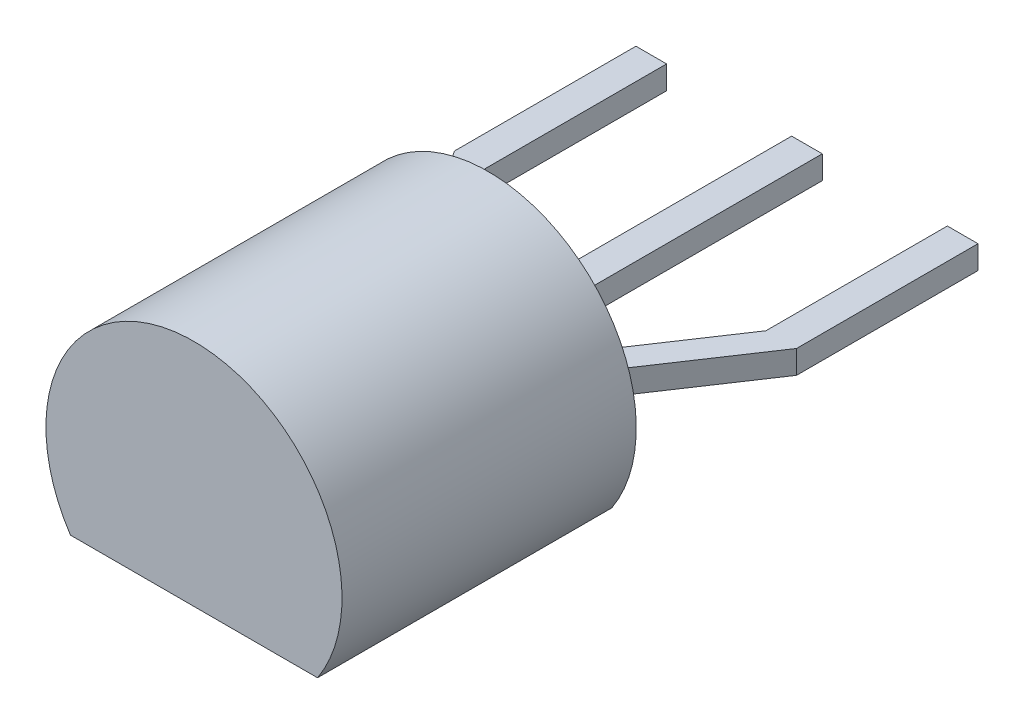
ISO-10303-21;
HEADER;
FILE_DESCRIPTION(('STEP AP214'),'2;1');
FILE_NAME('part.step','',(''),(''),'','','');
FILE_SCHEMA(('AUTOMOTIVE_DESIGN { 1 0 10303 214 1 1 1 1 }'));
ENDSEC;
DATA;
#1=APPLICATION_CONTEXT('core data for automotive mechanical design processes');
#2=APPLICATION_PROTOCOL_DEFINITION('international standard','automotive_design',2000,#1);
#3=PRODUCT_CONTEXT('',#1,'mechanical');
#4=PRODUCT('Part','Part','',(#3));
#5=PRODUCT_RELATED_PRODUCT_CATEGORY('part','',(#4));
#6=PRODUCT_DEFINITION_FORMATION('','',#4);
#7=PRODUCT_DEFINITION_CONTEXT('part definition',#1,'design');
#8=PRODUCT_DEFINITION('design','',#6,#7);
#9=PRODUCT_DEFINITION_SHAPE('','',#8);
#10=(LENGTH_UNIT() NAMED_UNIT(*) SI_UNIT(.MILLI.,.METRE.));
#11=(NAMED_UNIT(*) PLANE_ANGLE_UNIT() SI_UNIT($,.RADIAN.));
#12=(NAMED_UNIT(*) SI_UNIT($,.STERADIAN.) SOLID_ANGLE_UNIT());
#13=UNCERTAINTY_MEASURE_WITH_UNIT(LENGTH_MEASURE(1.E-05),#10,'distance_accuracy_value','');
#14=(GEOMETRIC_REPRESENTATION_CONTEXT(3) GLOBAL_UNCERTAINTY_ASSIGNED_CONTEXT((#13)) GLOBAL_UNIT_ASSIGNED_CONTEXT((#10,
#11,#12)) REPRESENTATION_CONTEXT('',''));
#15=CARTESIAN_POINT('',(0.,0.,0.));
#16=DIRECTION('',(0.,0.,1.));
#17=DIRECTION('',(1.,0.,0.));
#18=AXIS2_PLACEMENT_3D('',#15,#16,#17);
#19=CARTESIAN_POINT('',(0.524230916003,-1.33,2.5));
#20=DIRECTION('',(0.,1.,0.));
#21=DIRECTION('',(1.,0.,0.));
#22=AXIS2_PLACEMENT_3D('',#19,#20,#21);
#23=PLANE('',#22);
#24=DIRECTION('',(1.,0.,0.));
#25=VECTOR('',#24,1.);
#26=CARTESIAN_POINT('',(0.524230916003,-1.33,2.5));
#27=LINE('',#26,#25);
#28=CARTESIAN_POINT('',(0.524230916003,-1.33,2.5));
#29=VERTEX_POINT('',#28);
#30=CARTESIAN_POINT('',(4.555769083998,-1.33,2.5));
#31=VERTEX_POINT('',#30);
#32=EDGE_CURVE('E11',#29,#31,#27,.T.);
#33=ORIENTED_EDGE('',*,*,#32,.T.);
#34=DIRECTION('',(0.,0.,1.));
#35=VECTOR('',#34,1.);
#36=CARTESIAN_POINT('',(4.555769083998,-1.33,2.5));
#37=LINE('',#36,#35);
#38=CARTESIAN_POINT('',(4.555769083998,-1.33,7.3));
#39=VERTEX_POINT('',#38);
#40=EDGE_CURVE('E27',#31,#39,#37,.T.);
#41=ORIENTED_EDGE('',*,*,#40,.T.);
#42=DIRECTION('',(1.,0.,0.));
#43=VECTOR('',#42,1.);
#44=CARTESIAN_POINT('',(0.524230916003,-1.33,7.3));
#45=LINE('',#44,#43);
#46=CARTESIAN_POINT('',(0.524230916003,-1.33,7.3));
#47=VERTEX_POINT('',#46);
#48=EDGE_CURVE('E349',#47,#39,#45,.T.);
#49=ORIENTED_EDGE('',*,*,#48,.F.);
#50=DIRECTION('',(0.,0.,1.));
#51=VECTOR('',#50,1.);
#52=CARTESIAN_POINT('',(0.524230916003,-1.33,2.5));
#53=LINE('',#52,#51);
#54=EDGE_CURVE('E358',#29,#47,#53,.T.);
#55=ORIENTED_EDGE('',*,*,#54,.F.);
#56=EDGE_LOOP('',(#33,#41,#49,#55));
#57=FACE_BOUND('',#56,.T.);
#58=ADVANCED_FACE('F17',(#57),#23,.F.);
#59=CARTESIAN_POINT('',(2.54,0.,2.5));
#60=DIRECTION('',(0.,0.,-1.));
#61=DIRECTION('',(1.,0.,0.));
#62=AXIS2_PLACEMENT_3D('',#59,#60,#61);
#63=CYLINDRICAL_SURFACE('',#62,2.415);
#64=CARTESIAN_POINT('',(2.54,0.,2.5));
#65=DIRECTION('',(0.,0.,1.));
#66=DIRECTION('',(1.,0.,0.));
#67=AXIS2_PLACEMENT_3D('',#64,#65,#66);
#68=CIRCLE('',#67,2.415);
#69=EDGE_CURVE('E361',#31,#29,#68,.T.);
#70=ORIENTED_EDGE('',*,*,#69,.T.);
#71=ORIENTED_EDGE('',*,*,#54,.T.);
#72=CARTESIAN_POINT('',(2.54,0.,7.3));
#73=DIRECTION('',(0.,0.,1.));
#74=DIRECTION('',(1.,0.,0.));
#75=AXIS2_PLACEMENT_3D('',#72,#73,#74);
#76=CIRCLE('',#75,2.415);
#77=EDGE_CURVE('E351',#39,#47,#76,.T.);
#78=ORIENTED_EDGE('',*,*,#77,.F.);
#79=ORIENTED_EDGE('',*,*,#40,.F.);
#80=EDGE_LOOP('',(#70,#71,#78,#79));
#81=FACE_BOUND('',#80,.T.);
#82=ADVANCED_FACE('F409',(#81),#63,.T.);
#83=CARTESIAN_POINT('',(0.524230916003,-1.33,2.5));
#84=DIRECTION('',(0.,0.,-1.));
#85=DIRECTION('',(-1.,0.,0.));
#86=AXIS2_PLACEMENT_3D('',#83,#84,#85);
#87=PLANE('',#86);
#88=ORIENTED_EDGE('',*,*,#32,.F.);
#89=ORIENTED_EDGE('',*,*,#69,.F.);
#90=EDGE_LOOP('',(#88,#89));
#91=FACE_BOUND('',#90,.T.);
#92=DIRECTION('',(0.,-1.,0.));
#93=VECTOR('',#92,1.);
#94=CARTESIAN_POINT('',(2.79,-0.57,2.5));
#95=LINE('',#94,#93);
#96=CARTESIAN_POINT('',(2.79,0.19,2.5));
#97=VERTEX_POINT('',#96);
#98=CARTESIAN_POINT('',(2.79,-0.19,2.5));
#99=VERTEX_POINT('',#98);
#100=EDGE_CURVE('E302',#97,#99,#95,.T.);
#101=ORIENTED_EDGE('',*,*,#100,.F.);
#102=DIRECTION('',(-1.,0.,0.));
#103=VECTOR('',#102,1.);
#104=CARTESIAN_POINT('',(1.407115458001,0.19,2.5));
#105=LINE('',#104,#103);
#106=CARTESIAN_POINT('',(2.29,0.19,2.5));
#107=VERTEX_POINT('',#106);
#108=EDGE_CURVE('E350',#97,#107,#105,.T.);
#109=ORIENTED_EDGE('',*,*,#108,.T.);
#110=DIRECTION('',(0.,1.,0.));
#111=VECTOR('',#110,1.);
#112=CARTESIAN_POINT('',(2.29,-0.57,2.5));
#113=LINE('',#112,#111);
#114=CARTESIAN_POINT('',(2.29,-0.19,2.5));
#115=VERTEX_POINT('',#114);
#116=EDGE_CURVE('E297',#115,#107,#113,.T.);
#117=ORIENTED_EDGE('',*,*,#116,.F.);
#118=DIRECTION('',(-1.,0.,0.));
#119=VECTOR('',#118,1.);
#120=CARTESIAN_POINT('',(1.407115458001,-0.19,2.5));
#121=LINE('',#120,#119);
#122=EDGE_CURVE('E303',#99,#115,#121,.T.);
#123=ORIENTED_EDGE('',*,*,#122,.F.);
#124=EDGE_LOOP('',(#101,#109,#117,#123));
#125=FACE_BOUND('',#124,.T.);
#126=DIRECTION('',(0.,-1.,0.));
#127=VECTOR('',#126,1.);
#128=CARTESIAN_POINT('',(4.06,-0.57,2.5));
#129=LINE('',#128,#127);
#130=CARTESIAN_POINT('',(4.06,0.19,2.5));
#131=VERTEX_POINT('',#130);
#132=CARTESIAN_POINT('',(4.06,-0.19,2.5));
#133=VERTEX_POINT('',#132);
#134=EDGE_CURVE('E313',#131,#133,#129,.T.);
#135=ORIENTED_EDGE('',*,*,#134,.F.);
#136=DIRECTION('',(-1.,0.,0.));
#137=VECTOR('',#136,1.);
#138=CARTESIAN_POINT('',(2.927115458001,0.19,2.5));
#139=LINE('',#138,#137);
#140=CARTESIAN_POINT('',(3.56,0.19,2.5));
#141=VERTEX_POINT('',#140);
#142=EDGE_CURVE('E335',#131,#141,#139,.T.);
#143=ORIENTED_EDGE('',*,*,#142,.T.);
#144=DIRECTION('',(0.,1.,0.));
#145=VECTOR('',#144,1.);
#146=CARTESIAN_POINT('',(3.56,-0.57,2.5));
#147=LINE('',#146,#145);
#148=CARTESIAN_POINT('',(3.56,-0.19,2.5));
#149=VERTEX_POINT('',#148);
#150=EDGE_CURVE('E269',#149,#141,#147,.T.);
#151=ORIENTED_EDGE('',*,*,#150,.F.);
#152=DIRECTION('',(-1.,0.,0.));
#153=VECTOR('',#152,1.);
#154=CARTESIAN_POINT('',(2.927115458001,-0.19,2.5));
#155=LINE('',#154,#153);
#156=EDGE_CURVE('E328',#133,#149,#155,.T.);
#157=ORIENTED_EDGE('',*,*,#156,.F.);
#158=EDGE_LOOP('',(#135,#143,#151,#157));
#159=FACE_BOUND('',#158,.T.);
#160=DIRECTION('',(0.,-1.,0.));
#161=VECTOR('',#160,1.);
#162=CARTESIAN_POINT('',(1.52,-0.57,2.5));
#163=LINE('',#162,#161);
#164=CARTESIAN_POINT('',(1.52,0.19,2.5));
#165=VERTEX_POINT('',#164);
#166=CARTESIAN_POINT('',(1.52,-0.19,2.5));
#167=VERTEX_POINT('',#166);
#168=EDGE_CURVE('E278',#165,#167,#163,.T.);
#169=ORIENTED_EDGE('',*,*,#168,.F.);
#170=DIRECTION('',(-1.,0.,0.));
#171=VECTOR('',#170,1.);
#172=CARTESIAN_POINT('',(0.387115458001,0.19,2.5));
#173=LINE('',#172,#171);
#174=CARTESIAN_POINT('',(1.02,0.19,2.5));
#175=VERTEX_POINT('',#174);
#176=EDGE_CURVE('E290',#165,#175,#173,.T.);
#177=ORIENTED_EDGE('',*,*,#176,.T.);
#178=DIRECTION('',(0.,1.,0.));
#179=VECTOR('',#178,1.);
#180=CARTESIAN_POINT('',(1.02,-0.57,2.5));
#181=LINE('',#180,#179);
#182=CARTESIAN_POINT('',(1.02,-0.19,2.5));
#183=VERTEX_POINT('',#182);
#184=EDGE_CURVE('E229',#183,#175,#181,.T.);
#185=ORIENTED_EDGE('',*,*,#184,.F.);
#186=DIRECTION('',(-1.,0.,0.));
#187=VECTOR('',#186,1.);
#188=CARTESIAN_POINT('',(0.387115458001,-0.19,2.5));
#189=LINE('',#188,#187);
#190=EDGE_CURVE('E225',#167,#183,#189,.T.);
#191=ORIENTED_EDGE('',*,*,#190,.F.);
#192=EDGE_LOOP('',(#169,#177,#185,#191));
#193=FACE_BOUND('',#192,.T.);
#194=ADVANCED_FACE('F415',(#91,#125,#159,#193),#87,.T.);
#195=CARTESIAN_POINT('',(0.524230916003,-1.33,7.3));
#196=DIRECTION('',(0.,0.,-1.));
#197=DIRECTION('',(-1.,0.,0.));
#198=AXIS2_PLACEMENT_3D('',#195,#196,#197);
#199=PLANE('',#198);
#200=ORIENTED_EDGE('',*,*,#48,.T.);
#201=ORIENTED_EDGE('',*,*,#77,.T.);
#202=EDGE_LOOP('',(#200,#201));
#203=FACE_BOUND('',#202,.T.);
#204=ADVANCED_FACE('F420',(#203),#199,.F.);
#205=CARTESIAN_POINT('',(2.79,0.19,2.8));
#206=DIRECTION('',(1.,0.,0.));
#207=DIRECTION('',(0.,0.,-1.));
#208=AXIS2_PLACEMENT_3D('',#205,#206,#207);
#209=PLANE('',#208);
#210=DIRECTION('',(0.,0.,-1.));
#211=VECTOR('',#210,1.);
#212=CARTESIAN_POINT('',(2.79,0.19,2.8));
#213=LINE('',#212,#211);
#214=CARTESIAN_POINT('',(2.79,0.19,-2.7));
#215=VERTEX_POINT('',#214);
#216=EDGE_CURVE('E294',#97,#215,#213,.T.);
#217=ORIENTED_EDGE('',*,*,#216,.F.);
#218=ORIENTED_EDGE('',*,*,#100,.T.);
#219=DIRECTION('',(0.,0.,-1.));
#220=VECTOR('',#219,1.);
#221=CARTESIAN_POINT('',(2.79,-0.19,2.8));
#222=LINE('',#221,#220);
#223=CARTESIAN_POINT('',(2.79,-0.19,-2.7));
#224=VERTEX_POINT('',#223);
#225=EDGE_CURVE('E299',#99,#224,#222,.T.);
#226=ORIENTED_EDGE('',*,*,#225,.T.);
#227=DIRECTION('',(0.,-1.,0.));
#228=VECTOR('',#227,1.);
#229=CARTESIAN_POINT('',(2.79,0.19,-2.7));
#230=LINE('',#229,#228);
#231=EDGE_CURVE('E191',#215,#224,#230,.T.);
#232=ORIENTED_EDGE('',*,*,#231,.F.);
#233=EDGE_LOOP('',(#217,#218,#226,#232));
#234=FACE_BOUND('',#233,.T.);
#235=ADVANCED_FACE('F424',(#234),#209,.T.);
#236=CARTESIAN_POINT('',(2.29,-0.19,2.8));
#237=DIRECTION('',(0.,-1.,0.));
#238=DIRECTION('',(0.,0.,-1.));
#239=AXIS2_PLACEMENT_3D('',#236,#237,#238);
#240=PLANE('',#239);
#241=ORIENTED_EDGE('',*,*,#122,.T.);
#242=DIRECTION('',(0.,0.,1.));
#243=VECTOR('',#242,1.);
#244=CARTESIAN_POINT('',(2.29,-0.19,-2.7));
#245=LINE('',#244,#243);
#246=CARTESIAN_POINT('',(2.29,-0.19,-2.7));
#247=VERTEX_POINT('',#246);
#248=EDGE_CURVE('E305',#247,#115,#245,.T.);
#249=ORIENTED_EDGE('',*,*,#248,.F.);
#250=DIRECTION('',(-1.,0.,0.));
#251=VECTOR('',#250,1.);
#252=CARTESIAN_POINT('',(2.79,-0.19,-2.7));
#253=LINE('',#252,#251);
#254=EDGE_CURVE('E275',#224,#247,#253,.T.);
#255=ORIENTED_EDGE('',*,*,#254,.F.);
#256=ORIENTED_EDGE('',*,*,#225,.F.);
#257=EDGE_LOOP('',(#241,#249,#255,#256));
#258=FACE_BOUND('',#257,.T.);
#259=ADVANCED_FACE('F427',(#258),#240,.T.);
#260=CARTESIAN_POINT('',(2.29,0.19,-2.7));
#261=DIRECTION('',(-1.,0.,0.));
#262=DIRECTION('',(0.,0.,1.));
#263=AXIS2_PLACEMENT_3D('',#260,#261,#262);
#264=PLANE('',#263);
#265=DIRECTION('',(0.,0.,1.));
#266=VECTOR('',#265,1.);
#267=CARTESIAN_POINT('',(2.29,0.19,-2.7));
#268=LINE('',#267,#266);
#269=CARTESIAN_POINT('',(2.29,0.19,-2.7));
#270=VERTEX_POINT('',#269);
#271=EDGE_CURVE('E310',#270,#107,#268,.T.);
#272=ORIENTED_EDGE('',*,*,#271,.F.);
#273=DIRECTION('',(0.,-1.,0.));
#274=VECTOR('',#273,1.);
#275=CARTESIAN_POINT('',(2.29,0.19,-2.7));
#276=LINE('',#275,#274);
#277=EDGE_CURVE('E308',#270,#247,#276,.T.);
#278=ORIENTED_EDGE('',*,*,#277,.T.);
#279=ORIENTED_EDGE('',*,*,#248,.T.);
#280=ORIENTED_EDGE('',*,*,#116,.T.);
#281=EDGE_LOOP('',(#272,#278,#279,#280));
#282=FACE_BOUND('',#281,.T.);
#283=ADVANCED_FACE('F431',(#282),#264,.T.);
#284=CARTESIAN_POINT('',(2.29,0.19,2.8));
#285=DIRECTION('',(0.,-1.,0.));
#286=DIRECTION('',(0.,0.,-1.));
#287=AXIS2_PLACEMENT_3D('',#284,#285,#286);
#288=PLANE('',#287);
#289=ORIENTED_EDGE('',*,*,#216,.T.);
#290=DIRECTION('',(-1.,0.,0.));
#291=VECTOR('',#290,1.);
#292=CARTESIAN_POINT('',(2.79,0.19,-2.7));
#293=LINE('',#292,#291);
#294=EDGE_CURVE('E298',#215,#270,#293,.T.);
#295=ORIENTED_EDGE('',*,*,#294,.T.);
#296=ORIENTED_EDGE('',*,*,#271,.T.);
#297=ORIENTED_EDGE('',*,*,#108,.F.);
#298=EDGE_LOOP('',(#289,#295,#296,#297));
#299=FACE_BOUND('',#298,.T.);
#300=ADVANCED_FACE('F435',(#299),#288,.F.);
#301=CARTESIAN_POINT('',(4.06,0.19,2.8));
#302=DIRECTION('',(1.,0.,0.));
#303=DIRECTION('',(0.,0.,-1.));
#304=AXIS2_PLACEMENT_3D('',#301,#302,#303);
#305=PLANE('',#304);
#306=DIRECTION('',(0.,0.,-1.));
#307=VECTOR('',#306,1.);
#308=CARTESIAN_POINT('',(4.06,0.19,2.8));
#309=LINE('',#308,#307);
#310=CARTESIAN_POINT('',(4.06,0.19,2.16));
#311=VERTEX_POINT('',#310);
#312=EDGE_CURVE('E261',#131,#311,#309,.T.);
#313=ORIENTED_EDGE('',*,*,#312,.F.);
#314=ORIENTED_EDGE('',*,*,#134,.T.);
#315=DIRECTION('',(0.,0.,-1.));
#316=VECTOR('',#315,1.);
#317=CARTESIAN_POINT('',(4.06,-0.19,2.8));
#318=LINE('',#317,#316);
#319=CARTESIAN_POINT('',(4.06,-0.19,2.16));
#320=VERTEX_POINT('',#319);
#321=EDGE_CURVE('E320',#133,#320,#318,.T.);
#322=ORIENTED_EDGE('',*,*,#321,.T.);
#323=DIRECTION('',(0.,-1.,0.));
#324=VECTOR('',#323,1.);
#325=CARTESIAN_POINT('',(4.06,0.19,2.16));
#326=LINE('',#325,#324);
#327=EDGE_CURVE('E236',#311,#320,#326,.T.);
#328=ORIENTED_EDGE('',*,*,#327,.F.);
#329=EDGE_LOOP('',(#313,#314,#322,#328));
#330=FACE_BOUND('',#329,.T.);
#331=ADVANCED_FACE('F373',(#330),#305,.T.);
#332=CARTESIAN_POINT('',(5.33,-0.19,0.26));
#333=DIRECTION('',(0.,-1.,0.));
#334=DIRECTION('',(0.,0.,-1.));
#335=AXIS2_PLACEMENT_3D('',#332,#333,#334);
#336=PLANE('',#335);
#337=DIRECTION('',(0.,0.,-1.));
#338=VECTOR('',#337,1.);
#339=CARTESIAN_POINT('',(5.33,-0.19,0.26));
#340=LINE('',#339,#338);
#341=CARTESIAN_POINT('',(5.33,-0.19,0.26));
#342=VERTEX_POINT('',#341);
#343=CARTESIAN_POINT('',(5.33,-0.19,-2.7));
#344=VERTEX_POINT('',#343);
#345=EDGE_CURVE('E237',#342,#344,#340,.T.);
#346=ORIENTED_EDGE('',*,*,#345,.F.);
#347=DIRECTION('',(-0.555709556773992,0.,0.831376502259989));
#348=VECTOR('',#347,1.);
#349=CARTESIAN_POINT('',(5.33,-0.19,0.26));
#350=LINE('',#349,#348);
#351=EDGE_CURVE('E323',#342,#320,#350,.T.);
#352=ORIENTED_EDGE('',*,*,#351,.T.);
#353=ORIENTED_EDGE('',*,*,#321,.F.);
#354=ORIENTED_EDGE('',*,*,#156,.T.);
#355=DIRECTION('',(0.,0.,1.));
#356=VECTOR('',#355,1.);
#357=CARTESIAN_POINT('',(3.56,-0.19,2.16));
#358=LINE('',#357,#356);
#359=CARTESIAN_POINT('',(3.56,-0.19,2.16));
#360=VERTEX_POINT('',#359);
#361=EDGE_CURVE('E265',#360,#149,#358,.T.);
#362=ORIENTED_EDGE('',*,*,#361,.F.);
#363=DIRECTION('',(0.555709556773992,0.,-0.831376502259989));
#364=VECTOR('',#363,1.);
#365=CARTESIAN_POINT('',(3.56,-0.19,2.16));
#366=LINE('',#365,#364);
#367=CARTESIAN_POINT('',(4.83,-0.19,0.26));
#368=VERTEX_POINT('',#367);
#369=EDGE_CURVE('E254',#360,#368,#366,.T.);
#370=ORIENTED_EDGE('',*,*,#369,.T.);
#371=DIRECTION('',(0.,0.,1.));
#372=VECTOR('',#371,1.);
#373=CARTESIAN_POINT('',(4.83,-0.19,-2.7));
#374=LINE('',#373,#372);
#375=CARTESIAN_POINT('',(4.83,-0.19,-2.7));
#376=VERTEX_POINT('',#375);
#377=EDGE_CURVE('E243',#376,#368,#374,.T.);
#378=ORIENTED_EDGE('',*,*,#377,.F.);
#379=DIRECTION('',(-1.,0.,0.));
#380=VECTOR('',#379,1.);
#381=CARTESIAN_POINT('',(5.33,-0.19,-2.7));
#382=LINE('',#381,#380);
#383=EDGE_CURVE('E240',#344,#376,#382,.T.);
#384=ORIENTED_EDGE('',*,*,#383,.F.);
#385=EDGE_LOOP('',(#346,#352,#353,#354,#362,#370,#378,#384));
#386=FACE_BOUND('',#385,.T.);
#387=ADVANCED_FACE('F377',(#386),#336,.T.);
#388=CARTESIAN_POINT('',(3.56,0.19,2.16));
#389=DIRECTION('',(-1.,0.,0.));
#390=DIRECTION('',(0.,0.,1.));
#391=AXIS2_PLACEMENT_3D('',#388,#389,#390);
#392=PLANE('',#391);
#393=DIRECTION('',(0.,0.,1.));
#394=VECTOR('',#393,1.);
#395=CARTESIAN_POINT('',(3.56,0.19,2.16));
#396=LINE('',#395,#394);
#397=CARTESIAN_POINT('',(3.56,0.19,2.16));
#398=VERTEX_POINT('',#397);
#399=EDGE_CURVE('E257',#398,#141,#396,.T.);
#400=ORIENTED_EDGE('',*,*,#399,.F.);
#401=DIRECTION('',(0.,-1.,0.));
#402=VECTOR('',#401,1.);
#403=CARTESIAN_POINT('',(3.56,0.19,2.16));
#404=LINE('',#403,#402);
#405=EDGE_CURVE('E262',#398,#360,#404,.T.);
#406=ORIENTED_EDGE('',*,*,#405,.T.);
#407=ORIENTED_EDGE('',*,*,#361,.T.);
#408=ORIENTED_EDGE('',*,*,#150,.T.);
#409=EDGE_LOOP('',(#400,#406,#407,#408));
#410=FACE_BOUND('',#409,.T.);
#411=ADVANCED_FACE('F398',(#410),#392,.T.);
#412=CARTESIAN_POINT('',(5.33,0.19,0.26));
#413=DIRECTION('',(0.,-1.,0.));
#414=DIRECTION('',(0.,0.,-1.));
#415=AXIS2_PLACEMENT_3D('',#412,#413,#414);
#416=PLANE('',#415);
#417=DIRECTION('',(-1.,0.,0.));
#418=VECTOR('',#417,1.);
#419=CARTESIAN_POINT('',(5.33,0.19,-2.7));
#420=LINE('',#419,#418);
#421=CARTESIAN_POINT('',(5.33,0.19,-2.7));
#422=VERTEX_POINT('',#421);
#423=CARTESIAN_POINT('',(4.83,0.19,-2.7));
#424=VERTEX_POINT('',#423);
#425=EDGE_CURVE('E266',#422,#424,#420,.T.);
#426=ORIENTED_EDGE('',*,*,#425,.T.);
#427=DIRECTION('',(0.,0.,1.));
#428=VECTOR('',#427,1.);
#429=CARTESIAN_POINT('',(4.83,0.19,-2.7));
#430=LINE('',#429,#428);
#431=CARTESIAN_POINT('',(4.83,0.19,0.26));
#432=VERTEX_POINT('',#431);
#433=EDGE_CURVE('E260',#424,#432,#430,.T.);
#434=ORIENTED_EDGE('',*,*,#433,.T.);
#435=DIRECTION('',(0.555709556773992,0.,-0.831376502259989));
#436=VECTOR('',#435,1.);
#437=CARTESIAN_POINT('',(3.56,0.19,2.16));
#438=LINE('',#437,#436);
#439=EDGE_CURVE('E248',#398,#432,#438,.T.);
#440=ORIENTED_EDGE('',*,*,#439,.F.);
#441=ORIENTED_EDGE('',*,*,#399,.T.);
#442=ORIENTED_EDGE('',*,*,#142,.F.);
#443=ORIENTED_EDGE('',*,*,#312,.T.);
#444=DIRECTION('',(-0.555709556773992,0.,0.831376502259989));
#445=VECTOR('',#444,1.);
#446=CARTESIAN_POINT('',(5.33,0.19,0.26));
#447=LINE('',#446,#445);
#448=CARTESIAN_POINT('',(5.33,0.19,0.26));
#449=VERTEX_POINT('',#448);
#450=EDGE_CURVE('E272',#449,#311,#447,.T.);
#451=ORIENTED_EDGE('',*,*,#450,.F.);
#452=DIRECTION('',(0.,0.,-1.));
#453=VECTOR('',#452,1.);
#454=CARTESIAN_POINT('',(5.33,0.19,0.26));
#455=LINE('',#454,#453);
#456=EDGE_CURVE('E276',#449,#422,#455,.T.);
#457=ORIENTED_EDGE('',*,*,#456,.T.);
#458=EDGE_LOOP('',(#426,#434,#440,#441,#442,#443,#451,#457));
#459=FACE_BOUND('',#458,.T.);
#460=ADVANCED_FACE('F388',(#459),#416,.F.);
#461=CARTESIAN_POINT('',(1.52,0.19,2.8));
#462=DIRECTION('',(1.,0.,0.));
#463=DIRECTION('',(0.,0.,-1.));
#464=AXIS2_PLACEMENT_3D('',#461,#462,#463);
#465=PLANE('',#464);
#466=DIRECTION('',(0.,0.,-1.));
#467=VECTOR('',#466,1.);
#468=CARTESIAN_POINT('',(1.52,0.19,2.8));
#469=LINE('',#468,#467);
#470=CARTESIAN_POINT('',(1.52,0.19,2.16));
#471=VERTEX_POINT('',#470);
#472=EDGE_CURVE('E177',#165,#471,#469,.T.);
#473=ORIENTED_EDGE('',*,*,#472,.F.);
#474=ORIENTED_EDGE('',*,*,#168,.T.);
#475=DIRECTION('',(0.,0.,-1.));
#476=VECTOR('',#475,1.);
#477=CARTESIAN_POINT('',(1.52,-0.19,2.8));
#478=LINE('',#477,#476);
#479=CARTESIAN_POINT('',(1.52,-0.19,2.16));
#480=VERTEX_POINT('',#479);
#481=EDGE_CURVE('E280',#167,#480,#478,.T.);
#482=ORIENTED_EDGE('',*,*,#481,.T.);
#483=DIRECTION('',(0.,-1.,0.));
#484=VECTOR('',#483,1.);
#485=CARTESIAN_POINT('',(1.52,0.19,2.16));
#486=LINE('',#485,#484);
#487=EDGE_CURVE('E181',#471,#480,#486,.T.);
#488=ORIENTED_EDGE('',*,*,#487,.F.);
#489=EDGE_LOOP('',(#473,#474,#482,#488));
#490=FACE_BOUND('',#489,.T.);
#491=ADVANCED_FACE('F341',(#490),#465,.T.);
#492=CARTESIAN_POINT('',(0.25,-0.19,0.26));
#493=DIRECTION('',(0.,-1.,0.));
#494=DIRECTION('',(0.,0.,-1.));
#495=AXIS2_PLACEMENT_3D('',#492,#493,#494);
#496=PLANE('',#495);
#497=DIRECTION('',(0.,0.,-1.));
#498=VECTOR('',#497,1.);
#499=CARTESIAN_POINT('',(0.25,-0.19,0.26));
#500=LINE('',#499,#498);
#501=CARTESIAN_POINT('',(0.25,-0.19,0.26));
#502=VERTEX_POINT('',#501);
#503=CARTESIAN_POINT('',(0.25,-0.19,-2.7));
#504=VERTEX_POINT('',#503);
#505=EDGE_CURVE('E197',#502,#504,#500,.T.);
#506=ORIENTED_EDGE('',*,*,#505,.F.);
#507=DIRECTION('',(0.555709556773992,0.,0.831376502259989));
#508=VECTOR('',#507,1.);
#509=CARTESIAN_POINT('',(0.25,-0.19,0.26));
#510=LINE('',#509,#508);
#511=EDGE_CURVE('E196',#502,#480,#510,.T.);
#512=ORIENTED_EDGE('',*,*,#511,.T.);
#513=ORIENTED_EDGE('',*,*,#481,.F.);
#514=ORIENTED_EDGE('',*,*,#190,.T.);
#515=DIRECTION('',(0.,0.,1.));
#516=VECTOR('',#515,1.);
#517=CARTESIAN_POINT('',(1.02,-0.19,2.16));
#518=LINE('',#517,#516);
#519=CARTESIAN_POINT('',(1.02,-0.19,2.16));
#520=VERTEX_POINT('',#519);
#521=EDGE_CURVE('E226',#520,#183,#518,.T.);
#522=ORIENTED_EDGE('',*,*,#521,.F.);
#523=DIRECTION('',(0.555709556773992,0.,0.831376502259989));
#524=VECTOR('',#523,1.);
#525=CARTESIAN_POINT('',(-0.25,-0.19,0.26));
#526=LINE('',#525,#524);
#527=CARTESIAN_POINT('',(-0.25,-0.19,0.26));
#528=VERTEX_POINT('',#527);
#529=EDGE_CURVE('E215',#528,#520,#526,.T.);
#530=ORIENTED_EDGE('',*,*,#529,.F.);
#531=DIRECTION('',(0.,0.,1.));
#532=VECTOR('',#531,1.);
#533=CARTESIAN_POINT('',(-0.25,-0.19,-2.7));
#534=LINE('',#533,#532);
#535=CARTESIAN_POINT('',(-0.25,-0.19,-2.7));
#536=VERTEX_POINT('',#535);
#537=EDGE_CURVE('E207',#536,#528,#534,.T.);
#538=ORIENTED_EDGE('',*,*,#537,.F.);
#539=DIRECTION('',(-1.,0.,0.));
#540=VECTOR('',#539,1.);
#541=CARTESIAN_POINT('',(0.25,-0.19,-2.7));
#542=LINE('',#541,#540);
#543=EDGE_CURVE('E204',#504,#536,#542,.T.);
#544=ORIENTED_EDGE('',*,*,#543,.F.);
#545=EDGE_LOOP('',(#506,#512,#513,#514,#522,#530,#538,#544));
#546=FACE_BOUND('',#545,.T.);
#547=ADVANCED_FACE('F344',(#546),#496,.T.);
#548=CARTESIAN_POINT('',(1.02,0.19,2.16));
#549=DIRECTION('',(-1.,0.,0.));
#550=DIRECTION('',(0.,0.,1.));
#551=AXIS2_PLACEMENT_3D('',#548,#549,#550);
#552=PLANE('',#551);
#553=DIRECTION('',(0.,0.,1.));
#554=VECTOR('',#553,1.);
#555=CARTESIAN_POINT('',(1.02,0.19,2.16));
#556=LINE('',#555,#554);
#557=CARTESIAN_POINT('',(1.02,0.19,2.16));
#558=VERTEX_POINT('',#557);
#559=EDGE_CURVE('E219',#558,#175,#556,.T.);
#560=ORIENTED_EDGE('',*,*,#559,.F.);
#561=DIRECTION('',(0.,-1.,0.));
#562=VECTOR('',#561,1.);
#563=CARTESIAN_POINT('',(1.02,0.19,2.16));
#564=LINE('',#563,#562);
#565=EDGE_CURVE('E222',#558,#520,#564,.T.);
#566=ORIENTED_EDGE('',*,*,#565,.T.);
#567=ORIENTED_EDGE('',*,*,#521,.T.);
#568=ORIENTED_EDGE('',*,*,#184,.T.);
#569=EDGE_LOOP('',(#560,#566,#567,#568));
#570=FACE_BOUND('',#569,.T.);
#571=ADVANCED_FACE('F348',(#570),#552,.T.);
#572=CARTESIAN_POINT('',(0.25,0.19,0.26));
#573=DIRECTION('',(0.,-1.,0.));
#574=DIRECTION('',(0.,0.,-1.));
#575=AXIS2_PLACEMENT_3D('',#572,#573,#574);
#576=PLANE('',#575);
#577=DIRECTION('',(-1.,0.,0.));
#578=VECTOR('',#577,1.);
#579=CARTESIAN_POINT('',(0.25,0.19,-2.7));
#580=LINE('',#579,#578);
#581=CARTESIAN_POINT('',(0.25,0.19,-2.7));
#582=VERTEX_POINT('',#581);
#583=CARTESIAN_POINT('',(-0.25,0.19,-2.7));
#584=VERTEX_POINT('',#583);
#585=EDGE_CURVE('E227',#582,#584,#580,.T.);
#586=ORIENTED_EDGE('',*,*,#585,.T.);
#587=DIRECTION('',(0.,0.,1.));
#588=VECTOR('',#587,1.);
#589=CARTESIAN_POINT('',(-0.25,0.19,-2.7));
#590=LINE('',#589,#588);
#591=CARTESIAN_POINT('',(-0.25,0.19,0.26));
#592=VERTEX_POINT('',#591);
#593=EDGE_CURVE('E230',#584,#592,#590,.T.);
#594=ORIENTED_EDGE('',*,*,#593,.T.);
#595=DIRECTION('',(0.555709556773992,0.,0.831376502259989));
#596=VECTOR('',#595,1.);
#597=CARTESIAN_POINT('',(-0.25,0.19,0.26));
#598=LINE('',#597,#596);
#599=EDGE_CURVE('E163',#592,#558,#598,.T.);
#600=ORIENTED_EDGE('',*,*,#599,.T.);
#601=ORIENTED_EDGE('',*,*,#559,.T.);
#602=ORIENTED_EDGE('',*,*,#176,.F.);
#603=ORIENTED_EDGE('',*,*,#472,.T.);
#604=DIRECTION('',(0.555709556773992,0.,0.831376502259989));
#605=VECTOR('',#604,1.);
#606=CARTESIAN_POINT('',(0.25,0.19,0.26));
#607=LINE('',#606,#605);
#608=CARTESIAN_POINT('',(0.25,0.19,0.26));
#609=VERTEX_POINT('',#608);
#610=EDGE_CURVE('E169',#609,#471,#607,.T.);
#611=ORIENTED_EDGE('',*,*,#610,.F.);
#612=DIRECTION('',(0.,0.,-1.));
#613=VECTOR('',#612,1.);
#614=CARTESIAN_POINT('',(0.25,0.19,0.26));
#615=LINE('',#614,#613);
#616=EDGE_CURVE('E173',#609,#582,#615,.T.);
#617=ORIENTED_EDGE('',*,*,#616,.T.);
#618=EDGE_LOOP('',(#586,#594,#600,#601,#602,#603,#611,#617));
#619=FACE_BOUND('',#618,.T.);
#620=ADVANCED_FACE('F172',(#619),#576,.F.);
#621=CARTESIAN_POINT('',(2.79,0.19,-2.7));
#622=DIRECTION('',(0.,0.,-1.));
#623=DIRECTION('',(-1.,0.,0.));
#624=AXIS2_PLACEMENT_3D('',#621,#622,#623);
#625=PLANE('',#624);
#626=ORIENTED_EDGE('',*,*,#231,.T.);
#627=ORIENTED_EDGE('',*,*,#254,.T.);
#628=ORIENTED_EDGE('',*,*,#277,.F.);
#629=ORIENTED_EDGE('',*,*,#294,.F.);
#630=EDGE_LOOP('',(#626,#627,#628,#629));
#631=FACE_BOUND('',#630,.T.);
#632=ADVANCED_FACE('F505',(#631),#625,.T.);
#633=CARTESIAN_POINT('',(5.33,0.19,0.26));
#634=DIRECTION('',(-0.831376502259989,0.,-0.555709556773992));
#635=DIRECTION('',(-0.555709556773992,0.,0.831376502259989));
#636=AXIS2_PLACEMENT_3D('',#633,#634,#635);
#637=PLANE('',#636);
#638=ORIENTED_EDGE('',*,*,#450,.T.);
#639=ORIENTED_EDGE('',*,*,#327,.T.);
#640=ORIENTED_EDGE('',*,*,#351,.F.);
#641=DIRECTION('',(0.,-1.,0.));
#642=VECTOR('',#641,1.);
#643=CARTESIAN_POINT('',(5.33,0.19,0.26));
#644=LINE('',#643,#642);
#645=EDGE_CURVE('E233',#449,#342,#644,.T.);
#646=ORIENTED_EDGE('',*,*,#645,.F.);
#647=EDGE_LOOP('',(#638,#639,#640,#646));
#648=FACE_BOUND('',#647,.T.);
#649=ADVANCED_FACE('F381',(#648),#637,.F.);
#650=CARTESIAN_POINT('',(5.33,0.19,0.26));
#651=DIRECTION('',(1.,0.,0.));
#652=DIRECTION('',(0.,0.,-1.));
#653=AXIS2_PLACEMENT_3D('',#650,#651,#652);
#654=PLANE('',#653);
#655=ORIENTED_EDGE('',*,*,#645,.T.);
#656=ORIENTED_EDGE('',*,*,#345,.T.);
#657=DIRECTION('',(0.,-1.,0.));
#658=VECTOR('',#657,1.);
#659=CARTESIAN_POINT('',(5.33,0.19,-2.7));
#660=LINE('',#659,#658);
#661=EDGE_CURVE('E238',#422,#344,#660,.T.);
#662=ORIENTED_EDGE('',*,*,#661,.F.);
#663=ORIENTED_EDGE('',*,*,#456,.F.);
#664=EDGE_LOOP('',(#655,#656,#662,#663));
#665=FACE_BOUND('',#664,.T.);
#666=ADVANCED_FACE('F384',(#665),#654,.T.);
#667=CARTESIAN_POINT('',(5.33,0.19,-2.7));
#668=DIRECTION('',(0.,0.,-1.));
#669=DIRECTION('',(-1.,0.,0.));
#670=AXIS2_PLACEMENT_3D('',#667,#668,#669);
#671=PLANE('',#670);
#672=ORIENTED_EDGE('',*,*,#661,.T.);
#673=ORIENTED_EDGE('',*,*,#383,.T.);
#674=DIRECTION('',(0.,-1.,0.));
#675=VECTOR('',#674,1.);
#676=CARTESIAN_POINT('',(4.83,0.19,-2.7));
#677=LINE('',#676,#675);
#678=EDGE_CURVE('E241',#424,#376,#677,.T.);
#679=ORIENTED_EDGE('',*,*,#678,.F.);
#680=ORIENTED_EDGE('',*,*,#425,.F.);
#681=EDGE_LOOP('',(#672,#673,#679,#680));
#682=FACE_BOUND('',#681,.T.);
#683=ADVANCED_FACE('F390',(#682),#671,.T.);
#684=CARTESIAN_POINT('',(4.83,0.19,-2.7));
#685=DIRECTION('',(-1.,0.,0.));
#686=DIRECTION('',(0.,0.,1.));
#687=AXIS2_PLACEMENT_3D('',#684,#685,#686);
#688=PLANE('',#687);
#689=ORIENTED_EDGE('',*,*,#678,.T.);
#690=ORIENTED_EDGE('',*,*,#377,.T.);
#691=DIRECTION('',(0.,-1.,0.));
#692=VECTOR('',#691,1.);
#693=CARTESIAN_POINT('',(4.83,0.19,0.26));
#694=LINE('',#693,#692);
#695=EDGE_CURVE('E180',#432,#368,#694,.T.);
#696=ORIENTED_EDGE('',*,*,#695,.F.);
#697=ORIENTED_EDGE('',*,*,#433,.F.);
#698=EDGE_LOOP('',(#689,#690,#696,#697));
#699=FACE_BOUND('',#698,.T.);
#700=ADVANCED_FACE('F397',(#699),#688,.T.);
#701=CARTESIAN_POINT('',(3.56,0.19,2.16));
#702=DIRECTION('',(0.831376502259989,0.,0.555709556773992));
#703=DIRECTION('',(0.555709556773992,0.,-0.831376502259989));
#704=AXIS2_PLACEMENT_3D('',#701,#702,#703);
#705=PLANE('',#704);
#706=ORIENTED_EDGE('',*,*,#439,.T.);
#707=ORIENTED_EDGE('',*,*,#695,.T.);
#708=ORIENTED_EDGE('',*,*,#369,.F.);
#709=ORIENTED_EDGE('',*,*,#405,.F.);
#710=EDGE_LOOP('',(#706,#707,#708,#709));
#711=FACE_BOUND('',#710,.T.);
#712=ADVANCED_FACE('F395',(#711),#705,.F.);
#713=CARTESIAN_POINT('',(0.25,0.19,0.26));
#714=DIRECTION('',(-0.831376502259989,0.,0.555709556773992));
#715=DIRECTION('',(0.555709556773992,0.,0.831376502259989));
#716=AXIS2_PLACEMENT_3D('',#713,#714,#715);
#717=PLANE('',#716);
#718=ORIENTED_EDGE('',*,*,#610,.T.);
#719=ORIENTED_EDGE('',*,*,#487,.T.);
#720=ORIENTED_EDGE('',*,*,#511,.F.);
#721=DIRECTION('',(0.,-1.,0.));
#722=VECTOR('',#721,1.);
#723=CARTESIAN_POINT('',(0.25,0.19,0.26));
#724=LINE('',#723,#722);
#725=EDGE_CURVE('E188',#609,#502,#724,.T.);
#726=ORIENTED_EDGE('',*,*,#725,.F.);
#727=EDGE_LOOP('',(#718,#719,#720,#726));
#728=FACE_BOUND('',#727,.T.);
#729=ADVANCED_FACE('F194',(#728),#717,.F.);
#730=CARTESIAN_POINT('',(0.25,0.19,0.26));
#731=DIRECTION('',(1.,0.,0.));
#732=DIRECTION('',(0.,0.,-1.));
#733=AXIS2_PLACEMENT_3D('',#730,#731,#732);
#734=PLANE('',#733);
#735=ORIENTED_EDGE('',*,*,#725,.T.);
#736=ORIENTED_EDGE('',*,*,#505,.T.);
#737=DIRECTION('',(0.,-1.,0.));
#738=VECTOR('',#737,1.);
#739=CARTESIAN_POINT('',(0.25,0.19,-2.7));
#740=LINE('',#739,#738);
#741=EDGE_CURVE('E190',#582,#504,#740,.T.);
#742=ORIENTED_EDGE('',*,*,#741,.F.);
#743=ORIENTED_EDGE('',*,*,#616,.F.);
#744=EDGE_LOOP('',(#735,#736,#742,#743));
#745=FACE_BOUND('',#744,.T.);
#746=ADVANCED_FACE('F186',(#745),#734,.T.);
#747=CARTESIAN_POINT('',(0.25,0.19,-2.7));
#748=DIRECTION('',(0.,0.,-1.));
#749=DIRECTION('',(-1.,0.,0.));
#750=AXIS2_PLACEMENT_3D('',#747,#748,#749);
#751=PLANE('',#750);
#752=ORIENTED_EDGE('',*,*,#741,.T.);
#753=ORIENTED_EDGE('',*,*,#543,.T.);
#754=DIRECTION('',(0.,-1.,0.));
#755=VECTOR('',#754,1.);
#756=CARTESIAN_POINT('',(-0.25,0.19,-2.7));
#757=LINE('',#756,#755);
#758=EDGE_CURVE('E205',#584,#536,#757,.T.);
#759=ORIENTED_EDGE('',*,*,#758,.F.);
#760=ORIENTED_EDGE('',*,*,#585,.F.);
#761=EDGE_LOOP('',(#752,#753,#759,#760));
#762=FACE_BOUND('',#761,.T.);
#763=ADVANCED_FACE('F346',(#762),#751,.T.);
#764=CARTESIAN_POINT('',(-0.25,0.19,-2.7));
#765=DIRECTION('',(-1.,0.,0.));
#766=DIRECTION('',(0.,0.,1.));
#767=AXIS2_PLACEMENT_3D('',#764,#765,#766);
#768=PLANE('',#767);
#769=ORIENTED_EDGE('',*,*,#758,.T.);
#770=ORIENTED_EDGE('',*,*,#537,.T.);
#771=DIRECTION('',(0.,-1.,0.));
#772=VECTOR('',#771,1.);
#773=CARTESIAN_POINT('',(-0.25,0.19,0.26));
#774=LINE('',#773,#772);
#775=EDGE_CURVE('E21',#592,#528,#774,.T.);
#776=ORIENTED_EDGE('',*,*,#775,.F.);
#777=ORIENTED_EDGE('',*,*,#593,.F.);
#778=EDGE_LOOP('',(#769,#770,#776,#777));
#779=FACE_BOUND('',#778,.T.);
#780=ADVANCED_FACE('F347',(#779),#768,.T.);
#781=CARTESIAN_POINT('',(-0.25,0.19,0.26));
#782=DIRECTION('',(-0.831376502259989,0.,0.555709556773992));
#783=DIRECTION('',(0.555709556773992,0.,0.831376502259989));
#784=AXIS2_PLACEMENT_3D('',#781,#782,#783);
#785=PLANE('',#784);
#786=ORIENTED_EDGE('',*,*,#775,.T.);
#787=ORIENTED_EDGE('',*,*,#529,.T.);
#788=ORIENTED_EDGE('',*,*,#565,.F.);
#789=ORIENTED_EDGE('',*,*,#599,.F.);
#790=EDGE_LOOP('',(#786,#787,#788,#789));
#791=FACE_BOUND('',#790,.T.);
#792=ADVANCED_FACE('F19',(#791),#785,.T.);
#793=CLOSED_SHELL('',(#58,#82,#194,#204,#235,#259,#283,#300,#331,#387,#411,#460,#491,#547,#571,
#620,#632,#649,#666,#683,#700,#712,#729,#746,#763,#780,#792));
#794=MANIFOLD_SOLID_BREP('B1',#793);
#795=ADVANCED_BREP_SHAPE_REPRESENTATION('',(#18,#794),#14);
#796=SHAPE_DEFINITION_REPRESENTATION(#9,#795);
ENDSEC;
END-ISO-10303-21;
